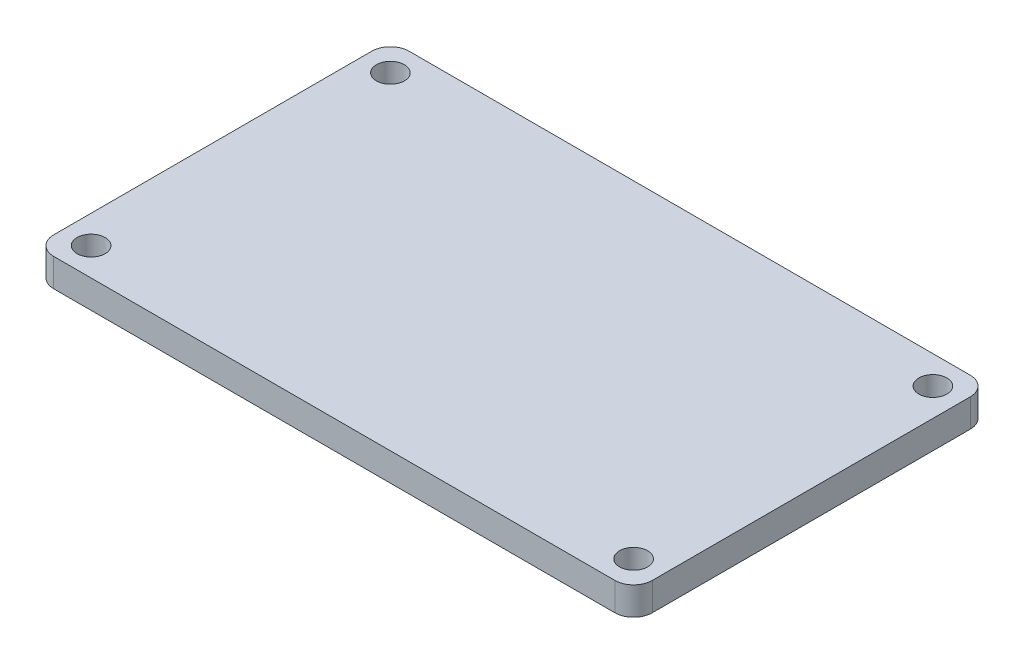
ISO-10303-21;
HEADER;
FILE_DESCRIPTION(('STEP AP214'),'2;1');
FILE_NAME('part.step','',(''),(''),'','','');
FILE_SCHEMA(('AUTOMOTIVE_DESIGN { 1 0 10303 214 1 1 1 1 }'));
ENDSEC;
DATA;
#1=APPLICATION_CONTEXT('core data for automotive mechanical design processes');
#2=APPLICATION_PROTOCOL_DEFINITION('international standard','automotive_design',2000,#1);
#3=PRODUCT_CONTEXT('',#1,'mechanical');
#4=PRODUCT('Part','Part','',(#3));
#5=PRODUCT_RELATED_PRODUCT_CATEGORY('part','',(#4));
#6=PRODUCT_DEFINITION_FORMATION('','',#4);
#7=PRODUCT_DEFINITION_CONTEXT('part definition',#1,'design');
#8=PRODUCT_DEFINITION('design','',#6,#7);
#9=PRODUCT_DEFINITION_SHAPE('','',#8);
#10=(LENGTH_UNIT() NAMED_UNIT(*) SI_UNIT(.MILLI.,.METRE.));
#11=(NAMED_UNIT(*) PLANE_ANGLE_UNIT() SI_UNIT($,.RADIAN.));
#12=(NAMED_UNIT(*) SI_UNIT($,.STERADIAN.) SOLID_ANGLE_UNIT());
#13=UNCERTAINTY_MEASURE_WITH_UNIT(LENGTH_MEASURE(1.E-05),#10,'distance_accuracy_value','');
#14=(GEOMETRIC_REPRESENTATION_CONTEXT(3) GLOBAL_UNCERTAINTY_ASSIGNED_CONTEXT((#13)) GLOBAL_UNIT_ASSIGNED_CONTEXT((#10,
#11,#12)) REPRESENTATION_CONTEXT('',''));
#15=CARTESIAN_POINT('',(0.,0.,0.));
#16=DIRECTION('',(0.,0.,1.));
#17=DIRECTION('',(1.,0.,0.));
#18=AXIS2_PLACEMENT_3D('',#15,#16,#17);
#19=CARTESIAN_POINT('',(-32.,3.,0.));
#20=DIRECTION('',(-1.,0.,0.));
#21=DIRECTION('',(0.,0.,1.));
#22=AXIS2_PLACEMENT_3D('',#19,#20,#21);
#23=PLANE('',#22);
#24=DIRECTION('',(0.,0.,-1.));
#25=VECTOR('',#24,1.);
#26=CARTESIAN_POINT('',(-32.,0.,0.));
#27=LINE('',#26,#25);
#28=CARTESIAN_POINT('',(-32.,0.,17.));
#29=VERTEX_POINT('',#28);
#30=CARTESIAN_POINT('',(-32.,0.,-17.));
#31=VERTEX_POINT('',#30);
#32=EDGE_CURVE('E203',#29,#31,#27,.T.);
#33=ORIENTED_EDGE('',*,*,#32,.F.);
#34=DIRECTION('',(0.,-1.,0.));
#35=VECTOR('',#34,1.);
#36=CARTESIAN_POINT('',(-32.,3.,17.));
#37=LINE('',#36,#35);
#38=CARTESIAN_POINT('',(-32.,3.,17.));
#39=VERTEX_POINT('',#38);
#40=EDGE_CURVE('E98',#39,#29,#37,.T.);
#41=ORIENTED_EDGE('',*,*,#40,.F.);
#42=DIRECTION('',(0.,0.,-1.));
#43=VECTOR('',#42,1.);
#44=CARTESIAN_POINT('',(-32.,3.,0.));
#45=LINE('',#44,#43);
#46=CARTESIAN_POINT('',(-32.,3.,-17.));
#47=VERTEX_POINT('',#46);
#48=EDGE_CURVE('E296',#39,#47,#45,.T.);
#49=ORIENTED_EDGE('',*,*,#48,.T.);
#50=DIRECTION('',(0.,-1.,0.));
#51=VECTOR('',#50,1.);
#52=CARTESIAN_POINT('',(-32.,3.,-17.));
#53=LINE('',#52,#51);
#54=EDGE_CURVE('E12',#47,#31,#53,.T.);
#55=ORIENTED_EDGE('',*,*,#54,.T.);
#56=EDGE_LOOP('',(#33,#41,#49,#55));
#57=FACE_BOUND('',#56,.T.);
#58=ADVANCED_FACE('F89',(#57),#23,.T.);
#59=CARTESIAN_POINT('',(-30.,3.,17.));
#60=DIRECTION('',(0.,-1.,0.));
#61=DIRECTION('',(0.,0.,-1.));
#62=AXIS2_PLACEMENT_3D('',#59,#60,#61);
#63=CYLINDRICAL_SURFACE('',#62,2.);
#64=CARTESIAN_POINT('',(-30.,0.,17.));
#65=DIRECTION('',(0.,1.,0.));
#66=DIRECTION('',(0.,0.,1.));
#67=AXIS2_PLACEMENT_3D('',#64,#65,#66);
#68=CIRCLE('',#67,2.);
#69=CARTESIAN_POINT('',(-30.,0.,19.));
#70=VERTEX_POINT('',#69);
#71=EDGE_CURVE('E193',#29,#70,#68,.T.);
#72=ORIENTED_EDGE('',*,*,#71,.T.);
#73=DIRECTION('',(0.,-1.,0.));
#74=VECTOR('',#73,1.);
#75=CARTESIAN_POINT('',(-30.,3.,19.));
#76=LINE('',#75,#74);
#77=CARTESIAN_POINT('',(-30.,3.,19.));
#78=VERTEX_POINT('',#77);
#79=EDGE_CURVE('E185',#78,#70,#76,.T.);
#80=ORIENTED_EDGE('',*,*,#79,.F.);
#81=CARTESIAN_POINT('',(-30.,3.,17.));
#82=DIRECTION('',(0.,1.,0.));
#83=DIRECTION('',(0.,0.,1.));
#84=AXIS2_PLACEMENT_3D('',#81,#82,#83);
#85=CIRCLE('',#84,2.);
#86=EDGE_CURVE('E195',#39,#78,#85,.T.);
#87=ORIENTED_EDGE('',*,*,#86,.F.);
#88=ORIENTED_EDGE('',*,*,#40,.T.);
#89=EDGE_LOOP('',(#72,#80,#87,#88));
#90=FACE_BOUND('',#89,.T.);
#91=ADVANCED_FACE('F191',(#90),#63,.T.);
#92=CARTESIAN_POINT('',(0.,3.,19.));
#93=DIRECTION('',(0.,0.,-1.));
#94=DIRECTION('',(-1.,0.,0.));
#95=AXIS2_PLACEMENT_3D('',#92,#93,#94);
#96=PLANE('',#95);
#97=DIRECTION('',(1.,0.,0.));
#98=VECTOR('',#97,1.);
#99=CARTESIAN_POINT('',(0.,0.,19.));
#100=LINE('',#99,#98);
#101=CARTESIAN_POINT('',(30.,0.,19.));
#102=VERTEX_POINT('',#101);
#103=EDGE_CURVE('E206',#70,#102,#100,.T.);
#104=ORIENTED_EDGE('',*,*,#103,.T.);
#105=DIRECTION('',(0.,-1.,0.));
#106=VECTOR('',#105,1.);
#107=CARTESIAN_POINT('',(30.,3.,19.));
#108=LINE('',#107,#106);
#109=CARTESIAN_POINT('',(30.,3.,19.));
#110=VERTEX_POINT('',#109);
#111=EDGE_CURVE('E179',#110,#102,#108,.T.);
#112=ORIENTED_EDGE('',*,*,#111,.F.);
#113=DIRECTION('',(1.,0.,0.));
#114=VECTOR('',#113,1.);
#115=CARTESIAN_POINT('',(0.,3.,19.));
#116=LINE('',#115,#114);
#117=EDGE_CURVE('E303',#78,#110,#116,.T.);
#118=ORIENTED_EDGE('',*,*,#117,.F.);
#119=ORIENTED_EDGE('',*,*,#79,.T.);
#120=EDGE_LOOP('',(#104,#112,#118,#119));
#121=FACE_BOUND('',#120,.T.);
#122=ADVANCED_FACE('F258',(#121),#96,.F.);
#123=CARTESIAN_POINT('',(30.,3.,17.));
#124=DIRECTION('',(0.,-1.,0.));
#125=DIRECTION('',(0.,0.,-1.));
#126=AXIS2_PLACEMENT_3D('',#123,#124,#125);
#127=CYLINDRICAL_SURFACE('',#126,2.);
#128=CARTESIAN_POINT('',(30.,0.,17.));
#129=DIRECTION('',(0.,1.,0.));
#130=DIRECTION('',(0.,0.,1.));
#131=AXIS2_PLACEMENT_3D('',#128,#129,#130);
#132=CIRCLE('',#131,2.);
#133=CARTESIAN_POINT('',(32.,0.,17.));
#134=VERTEX_POINT('',#133);
#135=EDGE_CURVE('E215',#134,#102,#132,.F.);
#136=ORIENTED_EDGE('',*,*,#135,.F.);
#137=DIRECTION('',(0.,-1.,0.));
#138=VECTOR('',#137,1.);
#139=CARTESIAN_POINT('',(32.,3.,17.));
#140=LINE('',#139,#138);
#141=CARTESIAN_POINT('',(32.,3.,17.));
#142=VERTEX_POINT('',#141);
#143=EDGE_CURVE('E177',#142,#134,#140,.T.);
#144=ORIENTED_EDGE('',*,*,#143,.F.);
#145=CARTESIAN_POINT('',(30.,3.,17.));
#146=DIRECTION('',(0.,1.,0.));
#147=DIRECTION('',(0.,0.,1.));
#148=AXIS2_PLACEMENT_3D('',#145,#146,#147);
#149=CIRCLE('',#148,2.);
#150=EDGE_CURVE('E171',#142,#110,#149,.F.);
#151=ORIENTED_EDGE('',*,*,#150,.T.);
#152=ORIENTED_EDGE('',*,*,#111,.T.);
#153=EDGE_LOOP('',(#136,#144,#151,#152));
#154=FACE_BOUND('',#153,.T.);
#155=ADVANCED_FACE('F263',(#154),#127,.T.);
#156=CARTESIAN_POINT('',(32.,3.,0.));
#157=DIRECTION('',(-1.,0.,0.));
#158=DIRECTION('',(0.,0.,1.));
#159=AXIS2_PLACEMENT_3D('',#156,#157,#158);
#160=PLANE('',#159);
#161=DIRECTION('',(0.,0.,-1.));
#162=VECTOR('',#161,1.);
#163=CARTESIAN_POINT('',(32.,0.,0.));
#164=LINE('',#163,#162);
#165=CARTESIAN_POINT('',(32.,0.,-17.));
#166=VERTEX_POINT('',#165);
#167=EDGE_CURVE('E176',#134,#166,#164,.T.);
#168=ORIENTED_EDGE('',*,*,#167,.T.);
#169=DIRECTION('',(0.,-1.,0.));
#170=VECTOR('',#169,1.);
#171=CARTESIAN_POINT('',(32.,3.,-17.));
#172=LINE('',#171,#170);
#173=CARTESIAN_POINT('',(32.,3.,-17.));
#174=VERTEX_POINT('',#173);
#175=EDGE_CURVE('E160',#174,#166,#172,.T.);
#176=ORIENTED_EDGE('',*,*,#175,.F.);
#177=DIRECTION('',(0.,0.,-1.));
#178=VECTOR('',#177,1.);
#179=CARTESIAN_POINT('',(32.,3.,0.));
#180=LINE('',#179,#178);
#181=EDGE_CURVE('E165',#142,#174,#180,.T.);
#182=ORIENTED_EDGE('',*,*,#181,.F.);
#183=ORIENTED_EDGE('',*,*,#143,.T.);
#184=EDGE_LOOP('',(#168,#176,#182,#183));
#185=FACE_BOUND('',#184,.T.);
#186=ADVANCED_FACE('F174',(#185),#160,.F.);
#187=CARTESIAN_POINT('',(30.,3.,-17.));
#188=DIRECTION('',(0.,-1.,0.));
#189=DIRECTION('',(0.,0.,-1.));
#190=AXIS2_PLACEMENT_3D('',#187,#188,#189);
#191=CYLINDRICAL_SURFACE('',#190,2.);
#192=CARTESIAN_POINT('',(30.,0.,-17.));
#193=DIRECTION('',(0.,1.,0.));
#194=DIRECTION('',(0.,0.,1.));
#195=AXIS2_PLACEMENT_3D('',#192,#193,#194);
#196=CIRCLE('',#195,2.);
#197=CARTESIAN_POINT('',(30.,0.,-19.));
#198=VERTEX_POINT('',#197);
#199=EDGE_CURVE('E218',#166,#198,#196,.T.);
#200=ORIENTED_EDGE('',*,*,#199,.T.);
#201=DIRECTION('',(0.,-1.,0.));
#202=VECTOR('',#201,1.);
#203=CARTESIAN_POINT('',(30.,3.,-19.));
#204=LINE('',#203,#202);
#205=CARTESIAN_POINT('',(30.,3.,-19.));
#206=VERTEX_POINT('',#205);
#207=EDGE_CURVE('E132',#206,#198,#204,.T.);
#208=ORIENTED_EDGE('',*,*,#207,.F.);
#209=CARTESIAN_POINT('',(30.,3.,-17.));
#210=DIRECTION('',(0.,1.,0.));
#211=DIRECTION('',(0.,0.,1.));
#212=AXIS2_PLACEMENT_3D('',#209,#210,#211);
#213=CIRCLE('',#212,2.);
#214=EDGE_CURVE('E156',#174,#206,#213,.T.);
#215=ORIENTED_EDGE('',*,*,#214,.F.);
#216=ORIENTED_EDGE('',*,*,#175,.T.);
#217=EDGE_LOOP('',(#200,#208,#215,#216));
#218=FACE_BOUND('',#217,.T.);
#219=ADVANCED_FACE('F158',(#218),#191,.T.);
#220=CARTESIAN_POINT('',(0.,3.,-19.));
#221=DIRECTION('',(0.,0.,-1.));
#222=DIRECTION('',(-1.,0.,0.));
#223=AXIS2_PLACEMENT_3D('',#220,#221,#222);
#224=PLANE('',#223);
#225=DIRECTION('',(1.,0.,0.));
#226=VECTOR('',#225,1.);
#227=CARTESIAN_POINT('',(0.,0.,-19.));
#228=LINE('',#227,#226);
#229=CARTESIAN_POINT('',(-30.,0.,-19.));
#230=VERTEX_POINT('',#229);
#231=EDGE_CURVE('E220',#230,#198,#228,.T.);
#232=ORIENTED_EDGE('',*,*,#231,.F.);
#233=DIRECTION('',(0.,-1.,0.));
#234=VECTOR('',#233,1.);
#235=CARTESIAN_POINT('',(-30.,3.,-19.));
#236=LINE('',#235,#234);
#237=CARTESIAN_POINT('',(-30.,3.,-19.));
#238=VERTEX_POINT('',#237);
#239=EDGE_CURVE('E106',#238,#230,#236,.T.);
#240=ORIENTED_EDGE('',*,*,#239,.F.);
#241=DIRECTION('',(1.,0.,0.));
#242=VECTOR('',#241,1.);
#243=CARTESIAN_POINT('',(0.,3.,-19.));
#244=LINE('',#243,#242);
#245=EDGE_CURVE('E164',#238,#206,#244,.T.);
#246=ORIENTED_EDGE('',*,*,#245,.T.);
#247=ORIENTED_EDGE('',*,*,#207,.T.);
#248=EDGE_LOOP('',(#232,#240,#246,#247));
#249=FACE_BOUND('',#248,.T.);
#250=ADVANCED_FACE('F250',(#249),#224,.T.);
#251=CARTESIAN_POINT('',(-30.,3.,-17.));
#252=DIRECTION('',(0.,-1.,0.));
#253=DIRECTION('',(0.,0.,-1.));
#254=AXIS2_PLACEMENT_3D('',#251,#252,#253);
#255=CYLINDRICAL_SURFACE('',#254,2.);
#256=CARTESIAN_POINT('',(-30.,0.,-17.));
#257=DIRECTION('',(0.,1.,0.));
#258=DIRECTION('',(0.,0.,1.));
#259=AXIS2_PLACEMENT_3D('',#256,#257,#258);
#260=CIRCLE('',#259,2.);
#261=EDGE_CURVE('E208',#31,#230,#260,.F.);
#262=ORIENTED_EDGE('',*,*,#261,.F.);
#263=ORIENTED_EDGE('',*,*,#54,.F.);
#264=CARTESIAN_POINT('',(-30.,3.,-17.));
#265=DIRECTION('',(0.,1.,0.));
#266=DIRECTION('',(0.,0.,1.));
#267=AXIS2_PLACEMENT_3D('',#264,#265,#266);
#268=CIRCLE('',#267,2.);
#269=EDGE_CURVE('E294',#47,#238,#268,.F.);
#270=ORIENTED_EDGE('',*,*,#269,.T.);
#271=ORIENTED_EDGE('',*,*,#239,.T.);
#272=EDGE_LOOP('',(#262,#263,#270,#271));
#273=FACE_BOUND('',#272,.T.);
#274=ADVANCED_FACE('F240',(#273),#255,.T.);
#275=CARTESIAN_POINT('',(-29.,3.,16.));
#276=DIRECTION('',(0.,-1.,0.));
#277=DIRECTION('',(0.,0.,-1.));
#278=AXIS2_PLACEMENT_3D('',#275,#276,#277);
#279=CYLINDRICAL_SURFACE('',#278,1.5);
#280=CARTESIAN_POINT('',(-29.,3.,16.));
#281=DIRECTION('',(0.,1.,0.));
#282=DIRECTION('',(0.,0.,1.));
#283=AXIS2_PLACEMENT_3D('',#280,#281,#282);
#284=CIRCLE('',#283,1.5);
#285=CARTESIAN_POINT('',(-29.,3.,17.5));
#286=VERTEX_POINT('',#285);
#287=EDGE_CURVE('E293',#286,#286,#284,.T.);
#288=ORIENTED_EDGE('',*,*,#287,.T.);
#289=EDGE_LOOP('',(#288));
#290=FACE_BOUND('',#289,.T.);
#291=CARTESIAN_POINT('',(-29.,0.,16.));
#292=DIRECTION('',(0.,1.,0.));
#293=DIRECTION('',(0.,0.,1.));
#294=AXIS2_PLACEMENT_3D('',#291,#292,#293);
#295=CIRCLE('',#294,1.5);
#296=CARTESIAN_POINT('',(-29.,0.,17.5));
#297=VERTEX_POINT('',#296);
#298=EDGE_CURVE('E210',#297,#297,#295,.T.);
#299=ORIENTED_EDGE('',*,*,#298,.F.);
#300=EDGE_LOOP('',(#299));
#301=FACE_BOUND('',#300,.T.);
#302=ADVANCED_FACE('F237',(#290,#301),#279,.F.);
#303=CARTESIAN_POINT('',(-29.,3.,-16.));
#304=DIRECTION('',(0.,-1.,0.));
#305=DIRECTION('',(0.,0.,-1.));
#306=AXIS2_PLACEMENT_3D('',#303,#304,#305);
#307=CYLINDRICAL_SURFACE('',#306,1.5);
#308=CARTESIAN_POINT('',(-29.,3.,-16.));
#309=DIRECTION('',(0.,1.,0.));
#310=DIRECTION('',(0.,0.,1.));
#311=AXIS2_PLACEMENT_3D('',#308,#309,#310);
#312=CIRCLE('',#311,1.5);
#313=CARTESIAN_POINT('',(-29.,3.,-14.5));
#314=VERTEX_POINT('',#313);
#315=EDGE_CURVE('E291',#314,#314,#312,.T.);
#316=ORIENTED_EDGE('',*,*,#315,.T.);
#317=EDGE_LOOP('',(#316));
#318=FACE_BOUND('',#317,.T.);
#319=CARTESIAN_POINT('',(-29.,0.,-16.));
#320=DIRECTION('',(0.,1.,0.));
#321=DIRECTION('',(0.,0.,1.));
#322=AXIS2_PLACEMENT_3D('',#319,#320,#321);
#323=CIRCLE('',#322,1.5);
#324=CARTESIAN_POINT('',(-29.,0.,-14.5));
#325=VERTEX_POINT('',#324);
#326=EDGE_CURVE('E231',#325,#325,#323,.T.);
#327=ORIENTED_EDGE('',*,*,#326,.F.);
#328=EDGE_LOOP('',(#327));
#329=FACE_BOUND('',#328,.T.);
#330=ADVANCED_FACE('F239',(#318,#329),#307,.F.);
#331=CARTESIAN_POINT('',(29.,3.,16.));
#332=DIRECTION('',(0.,-1.,0.));
#333=DIRECTION('',(0.,0.,-1.));
#334=AXIS2_PLACEMENT_3D('',#331,#332,#333);
#335=CYLINDRICAL_SURFACE('',#334,1.5);
#336=CARTESIAN_POINT('',(29.,3.,16.));
#337=DIRECTION('',(0.,1.,0.));
#338=DIRECTION('',(0.,0.,1.));
#339=AXIS2_PLACEMENT_3D('',#336,#337,#338);
#340=CIRCLE('',#339,1.5);
#341=CARTESIAN_POINT('',(29.,3.,17.5));
#342=VERTEX_POINT('',#341);
#343=EDGE_CURVE('E287',#342,#342,#340,.T.);
#344=ORIENTED_EDGE('',*,*,#343,.T.);
#345=EDGE_LOOP('',(#344));
#346=FACE_BOUND('',#345,.T.);
#347=CARTESIAN_POINT('',(29.,0.,16.));
#348=DIRECTION('',(0.,1.,0.));
#349=DIRECTION('',(0.,0.,1.));
#350=AXIS2_PLACEMENT_3D('',#347,#348,#349);
#351=CIRCLE('',#350,1.5);
#352=CARTESIAN_POINT('',(29.,0.,17.5));
#353=VERTEX_POINT('',#352);
#354=EDGE_CURVE('E228',#353,#353,#351,.T.);
#355=ORIENTED_EDGE('',*,*,#354,.F.);
#356=EDGE_LOOP('',(#355));
#357=FACE_BOUND('',#356,.T.);
#358=ADVANCED_FACE('F247',(#346,#357),#335,.F.);
#359=CARTESIAN_POINT('',(29.,3.,-16.));
#360=DIRECTION('',(0.,-1.,0.));
#361=DIRECTION('',(0.,0.,-1.));
#362=AXIS2_PLACEMENT_3D('',#359,#360,#361);
#363=CYLINDRICAL_SURFACE('',#362,1.5);
#364=CARTESIAN_POINT('',(29.,3.,-16.));
#365=DIRECTION('',(0.,1.,0.));
#366=DIRECTION('',(0.,0.,1.));
#367=AXIS2_PLACEMENT_3D('',#364,#365,#366);
#368=CIRCLE('',#367,1.5);
#369=CARTESIAN_POINT('',(29.,3.,-14.5));
#370=VERTEX_POINT('',#369);
#371=EDGE_CURVE('E222',#370,#370,#368,.T.);
#372=ORIENTED_EDGE('',*,*,#371,.T.);
#373=EDGE_LOOP('',(#372));
#374=FACE_BOUND('',#373,.T.);
#375=CARTESIAN_POINT('',(29.,0.,-16.));
#376=DIRECTION('',(0.,1.,0.));
#377=DIRECTION('',(0.,0.,1.));
#378=AXIS2_PLACEMENT_3D('',#375,#376,#377);
#379=CIRCLE('',#378,1.5);
#380=CARTESIAN_POINT('',(29.,0.,-14.5));
#381=VERTEX_POINT('',#380);
#382=EDGE_CURVE('E225',#381,#381,#379,.T.);
#383=ORIENTED_EDGE('',*,*,#382,.F.);
#384=EDGE_LOOP('',(#383));
#385=FACE_BOUND('',#384,.T.);
#386=ADVANCED_FACE('F91',(#374,#385),#363,.F.);
#387=CARTESIAN_POINT('',(0.,0.,0.));
#388=DIRECTION('',(0.,1.,0.));
#389=DIRECTION('',(0.,0.,1.));
#390=AXIS2_PLACEMENT_3D('',#387,#388,#389);
#391=PLANE('',#390);
#392=ORIENTED_EDGE('',*,*,#382,.T.);
#393=EDGE_LOOP('',(#392));
#394=FACE_BOUND('',#393,.T.);
#395=ORIENTED_EDGE('',*,*,#354,.T.);
#396=EDGE_LOOP('',(#395));
#397=FACE_BOUND('',#396,.T.);
#398=ORIENTED_EDGE('',*,*,#326,.T.);
#399=EDGE_LOOP('',(#398));
#400=FACE_BOUND('',#399,.T.);
#401=ORIENTED_EDGE('',*,*,#298,.T.);
#402=EDGE_LOOP('',(#401));
#403=FACE_BOUND('',#402,.T.);
#404=ORIENTED_EDGE('',*,*,#261,.T.);
#405=ORIENTED_EDGE('',*,*,#231,.T.);
#406=ORIENTED_EDGE('',*,*,#199,.F.);
#407=ORIENTED_EDGE('',*,*,#167,.F.);
#408=ORIENTED_EDGE('',*,*,#135,.T.);
#409=ORIENTED_EDGE('',*,*,#103,.F.);
#410=ORIENTED_EDGE('',*,*,#71,.F.);
#411=ORIENTED_EDGE('',*,*,#32,.T.);
#412=EDGE_LOOP('',(#404,#405,#406,#407,#408,#409,#410,#411));
#413=FACE_BOUND('',#412,.T.);
#414=ADVANCED_FACE('F202',(#394,#397,#400,#403,#413),#391,.F.);
#415=CARTESIAN_POINT('',(0.,3.,0.));
#416=DIRECTION('',(0.,1.,0.));
#417=DIRECTION('',(0.,0.,1.));
#418=AXIS2_PLACEMENT_3D('',#415,#416,#417);
#419=PLANE('',#418);
#420=ORIENTED_EDGE('',*,*,#371,.F.);
#421=EDGE_LOOP('',(#420));
#422=FACE_BOUND('',#421,.T.);
#423=ORIENTED_EDGE('',*,*,#343,.F.);
#424=EDGE_LOOP('',(#423));
#425=FACE_BOUND('',#424,.T.);
#426=ORIENTED_EDGE('',*,*,#315,.F.);
#427=EDGE_LOOP('',(#426));
#428=FACE_BOUND('',#427,.T.);
#429=ORIENTED_EDGE('',*,*,#287,.F.);
#430=EDGE_LOOP('',(#429));
#431=FACE_BOUND('',#430,.T.);
#432=ORIENTED_EDGE('',*,*,#269,.F.);
#433=ORIENTED_EDGE('',*,*,#48,.F.);
#434=ORIENTED_EDGE('',*,*,#86,.T.);
#435=ORIENTED_EDGE('',*,*,#117,.T.);
#436=ORIENTED_EDGE('',*,*,#150,.F.);
#437=ORIENTED_EDGE('',*,*,#181,.T.);
#438=ORIENTED_EDGE('',*,*,#214,.T.);
#439=ORIENTED_EDGE('',*,*,#245,.F.);
#440=EDGE_LOOP('',(#432,#433,#434,#435,#436,#437,#438,#439));
#441=FACE_BOUND('',#440,.T.);
#442=ADVANCED_FACE('F169',(#422,#425,#428,#431,#441),#419,.T.);
#443=CLOSED_SHELL('',(#58,#91,#122,#155,#186,#219,#250,#274,#302,#330,#358,#386,#414,#442));
#444=MANIFOLD_SOLID_BREP('B2',#443);
#445=ADVANCED_BREP_SHAPE_REPRESENTATION('',(#18,#444),#14);
#446=SHAPE_DEFINITION_REPRESENTATION(#9,#445);
ENDSEC;
END-ISO-10303-21;
